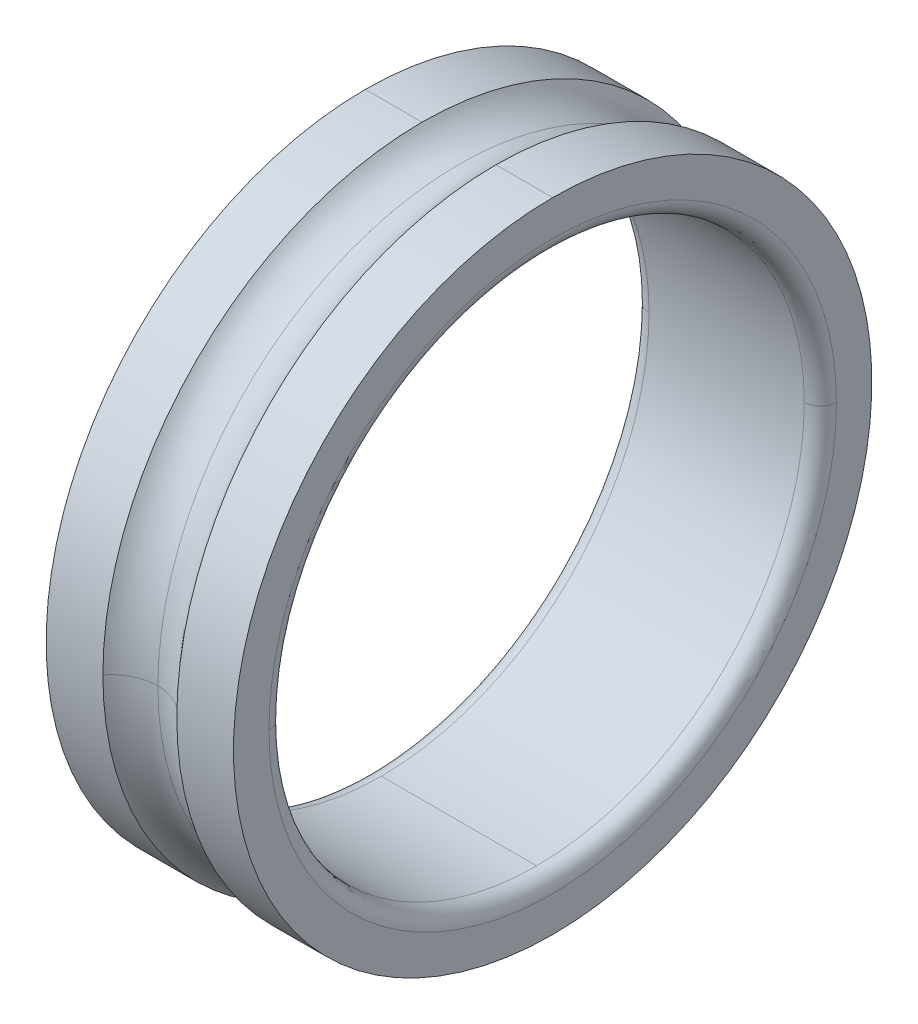
ISO-10303-21;
HEADER;
FILE_DESCRIPTION(('STEP AP214'),'2;1');
FILE_NAME('part.step','',(''),(''),'','','');
FILE_SCHEMA(('AUTOMOTIVE_DESIGN { 1 0 10303 214 1 1 1 1 }'));
ENDSEC;
DATA;
#1=APPLICATION_CONTEXT('core data for automotive mechanical design processes');
#2=APPLICATION_PROTOCOL_DEFINITION('international standard','automotive_design',2000,#1);
#3=PRODUCT_CONTEXT('',#1,'mechanical');
#4=PRODUCT('Part','Part','',(#3));
#5=PRODUCT_RELATED_PRODUCT_CATEGORY('part','',(#4));
#6=PRODUCT_DEFINITION_FORMATION('','',#4);
#7=PRODUCT_DEFINITION_CONTEXT('part definition',#1,'design');
#8=PRODUCT_DEFINITION('design','',#6,#7);
#9=PRODUCT_DEFINITION_SHAPE('','',#8);
#10=(LENGTH_UNIT() NAMED_UNIT(*) SI_UNIT(.MILLI.,.METRE.));
#11=(NAMED_UNIT(*) PLANE_ANGLE_UNIT() SI_UNIT($,.RADIAN.));
#12=(NAMED_UNIT(*) SI_UNIT($,.STERADIAN.) SOLID_ANGLE_UNIT());
#13=UNCERTAINTY_MEASURE_WITH_UNIT(LENGTH_MEASURE(1.E-05),#10,'distance_accuracy_value','');
#14=(GEOMETRIC_REPRESENTATION_CONTEXT(3) GLOBAL_UNCERTAINTY_ASSIGNED_CONTEXT((#13)) GLOBAL_UNIT_ASSIGNED_CONTEXT((#10,
#11,#12)) REPRESENTATION_CONTEXT('',''));
#15=CARTESIAN_POINT('',(0.,0.,0.));
#16=DIRECTION('',(0.,0.,1.));
#17=DIRECTION('',(1.,0.,0.));
#18=AXIS2_PLACEMENT_3D('',#15,#16,#17);
#19=CARTESIAN_POINT('',(7.,11.2625,0.));
#20=DIRECTION('',(1.,0.,0.));
#21=DIRECTION('',(0.,1.,0.));
#22=AXIS2_PLACEMENT_3D('',#19,#20,#21);
#23=PLANE('',#22);
#24=CARTESIAN_POINT('',(7.,0.,0.));
#25=DIRECTION('',(1.,0.,0.));
#26=DIRECTION('',(0.,1.,0.));
#27=AXIS2_PLACEMENT_3D('',#24,#25,#26);
#28=CIRCLE('',#27,10.6);
#29=CARTESIAN_POINT('',(7.,0.,-10.6));
#30=VERTEX_POINT('',#29);
#31=CARTESIAN_POINT('',(7.,0.,10.6));
#32=VERTEX_POINT('',#31);
#33=EDGE_CURVE('E130',#30,#32,#28,.T.);
#34=ORIENTED_EDGE('',*,*,#33,.F.);
#35=CARTESIAN_POINT('',(7.,0.,0.));
#36=DIRECTION('',(1.,0.,0.));
#37=DIRECTION('',(0.,1.,0.));
#38=AXIS2_PLACEMENT_3D('',#35,#36,#37);
#39=CIRCLE('',#38,10.6);
#40=EDGE_CURVE('E11',#32,#30,#39,.T.);
#41=ORIENTED_EDGE('',*,*,#40,.F.);
#42=EDGE_LOOP('',(#34,#41));
#43=FACE_BOUND('',#42,.T.);
#44=CARTESIAN_POINT('',(7.,0.,0.));
#45=DIRECTION('',(1.,0.,0.));
#46=DIRECTION('',(0.,1.,0.));
#47=AXIS2_PLACEMENT_3D('',#44,#45,#46);
#48=CIRCLE('',#47,11.925);
#49=CARTESIAN_POINT('',(7.,11.925,0.));
#50=VERTEX_POINT('',#49);
#51=CARTESIAN_POINT('',(7.,-11.925,0.));
#52=VERTEX_POINT('',#51);
#53=EDGE_CURVE('E43',#50,#52,#48,.T.);
#54=ORIENTED_EDGE('',*,*,#53,.T.);
#55=CARTESIAN_POINT('',(7.,0.,0.));
#56=DIRECTION('',(1.,0.,0.));
#57=DIRECTION('',(0.,1.,0.));
#58=AXIS2_PLACEMENT_3D('',#55,#56,#57);
#59=CIRCLE('',#58,11.925);
#60=EDGE_CURVE('E165',#52,#50,#59,.T.);
#61=ORIENTED_EDGE('',*,*,#60,.T.);
#62=EDGE_LOOP('',(#54,#61));
#63=FACE_BOUND('',#62,.T.);
#64=ADVANCED_FACE('F17',(#43,#63),#23,.T.);
#65=CARTESIAN_POINT('',(6.4,0.,0.));
#66=DIRECTION('',(1.,0.,0.));
#67=DIRECTION('',(0.,0.,-1.));
#68=AXIS2_PLACEMENT_3D('',#65,#66,#67);
#69=TOROIDAL_SURFACE('',#68,10.6,0.6);
#70=CARTESIAN_POINT('',(6.4,0.,10.6));
#71=DIRECTION('',(0.,1.,0.));
#72=DIRECTION('',(0.,0.,1.));
#73=AXIS2_PLACEMENT_3D('',#70,#71,#72);
#74=CIRCLE('',#73,0.6);
#75=CARTESIAN_POINT('',(6.4,0.,10.));
#76=VERTEX_POINT('',#75);
#77=EDGE_CURVE('E135',#32,#76,#74,.T.);
#78=ORIENTED_EDGE('',*,*,#77,.F.);
#79=ORIENTED_EDGE('',*,*,#40,.T.);
#80=CARTESIAN_POINT('',(6.4,0.,-10.6));
#81=DIRECTION('',(0.,-1.,0.));
#82=DIRECTION('',(0.,0.,-1.));
#83=AXIS2_PLACEMENT_3D('',#80,#81,#82);
#84=CIRCLE('',#83,0.6);
#85=CARTESIAN_POINT('',(6.4,0.,-10.));
#86=VERTEX_POINT('',#85);
#87=EDGE_CURVE('E147',#30,#86,#84,.T.);
#88=ORIENTED_EDGE('',*,*,#87,.T.);
#89=CARTESIAN_POINT('',(6.4,0.,0.));
#90=DIRECTION('',(1.,0.,0.));
#91=DIRECTION('',(0.,1.,0.));
#92=AXIS2_PLACEMENT_3D('',#89,#90,#91);
#93=CIRCLE('',#92,10.);
#94=CARTESIAN_POINT('',(6.4,-10.,0.));
#95=VERTEX_POINT('',#94);
#96=EDGE_CURVE('E28',#95,#86,#93,.T.);
#97=ORIENTED_EDGE('',*,*,#96,.F.);
#98=CARTESIAN_POINT('',(6.4,0.,0.));
#99=DIRECTION('',(1.,0.,0.));
#100=DIRECTION('',(0.,1.,0.));
#101=AXIS2_PLACEMENT_3D('',#98,#99,#100);
#102=CIRCLE('',#101,10.);
#103=EDGE_CURVE('E138',#76,#95,#102,.T.);
#104=ORIENTED_EDGE('',*,*,#103,.F.);
#105=EDGE_LOOP('',(#78,#79,#88,#97,#104));
#106=FACE_BOUND('',#105,.T.);
#107=ADVANCED_FACE('F136',(#106),#69,.T.);
#108=CARTESIAN_POINT('',(3.5,0.,0.));
#109=DIRECTION('',(-1.,0.,0.));
#110=DIRECTION('',(0.,1.,0.));
#111=AXIS2_PLACEMENT_3D('',#108,#109,#110);
#112=CYLINDRICAL_SURFACE('',#111,10.);
#113=DIRECTION('',(-1.,0.,0.));
#114=VECTOR('',#113,1.);
#115=CARTESIAN_POINT('',(3.5,-10.,0.));
#116=LINE('',#115,#114);
#117=CARTESIAN_POINT('',(0.6,-10.,0.));
#118=VERTEX_POINT('',#117);
#119=EDGE_CURVE('E176',#95,#118,#116,.T.);
#120=ORIENTED_EDGE('',*,*,#119,.F.);
#121=ORIENTED_EDGE('',*,*,#96,.T.);
#122=CARTESIAN_POINT('',(6.4,0.,0.));
#123=DIRECTION('',(1.,0.,0.));
#124=DIRECTION('',(0.,1.,0.));
#125=AXIS2_PLACEMENT_3D('',#122,#123,#124);
#126=CIRCLE('',#125,10.);
#127=CARTESIAN_POINT('',(6.4,10.,0.));
#128=VERTEX_POINT('',#127);
#129=EDGE_CURVE('E170',#86,#128,#126,.T.);
#130=ORIENTED_EDGE('',*,*,#129,.T.);
#131=DIRECTION('',(-1.,0.,0.));
#132=VECTOR('',#131,1.);
#133=CARTESIAN_POINT('',(3.5,10.,0.));
#134=LINE('',#133,#132);
#135=CARTESIAN_POINT('',(0.6,10.,0.));
#136=VERTEX_POINT('',#135);
#137=EDGE_CURVE('E208',#128,#136,#134,.T.);
#138=ORIENTED_EDGE('',*,*,#137,.T.);
#139=CARTESIAN_POINT('',(0.6,0.,0.));
#140=DIRECTION('',(1.,0.,0.));
#141=DIRECTION('',(0.,1.,0.));
#142=AXIS2_PLACEMENT_3D('',#139,#140,#141);
#143=CIRCLE('',#142,10.);
#144=CARTESIAN_POINT('',(0.6,0.,-10.));
#145=VERTEX_POINT('',#144);
#146=EDGE_CURVE('E270',#145,#136,#143,.T.);
#147=ORIENTED_EDGE('',*,*,#146,.F.);
#148=CARTESIAN_POINT('',(0.6,0.,0.));
#149=DIRECTION('',(1.,0.,0.));
#150=DIRECTION('',(0.,1.,0.));
#151=AXIS2_PLACEMENT_3D('',#148,#149,#150);
#152=CIRCLE('',#151,10.);
#153=EDGE_CURVE('E198',#118,#145,#152,.T.);
#154=ORIENTED_EDGE('',*,*,#153,.F.);
#155=EDGE_LOOP('',(#120,#121,#130,#138,#147,#154));
#156=FACE_BOUND('',#155,.T.);
#157=ADVANCED_FACE('F331',(#156),#112,.F.);
#158=CARTESIAN_POINT('',(0.6,0.,0.));
#159=DIRECTION('',(1.,0.,0.));
#160=DIRECTION('',(0.,0.,-1.));
#161=AXIS2_PLACEMENT_3D('',#158,#159,#160);
#162=TOROIDAL_SURFACE('',#161,10.6,0.6);
#163=CARTESIAN_POINT('',(0.6,0.,10.6));
#164=DIRECTION('',(0.,1.,0.));
#165=DIRECTION('',(0.,0.,1.));
#166=AXIS2_PLACEMENT_3D('',#163,#164,#165);
#167=CIRCLE('',#166,0.6);
#168=CARTESIAN_POINT('',(0.6,0.,10.));
#169=VERTEX_POINT('',#168);
#170=CARTESIAN_POINT('',(0.,0.,10.6));
#171=VERTEX_POINT('',#170);
#172=EDGE_CURVE('E189',#169,#171,#167,.T.);
#173=ORIENTED_EDGE('',*,*,#172,.F.);
#174=CARTESIAN_POINT('',(0.6,0.,0.));
#175=DIRECTION('',(1.,0.,0.));
#176=DIRECTION('',(0.,1.,0.));
#177=AXIS2_PLACEMENT_3D('',#174,#175,#176);
#178=CIRCLE('',#177,10.);
#179=EDGE_CURVE('E180',#169,#118,#178,.T.);
#180=ORIENTED_EDGE('',*,*,#179,.T.);
#181=ORIENTED_EDGE('',*,*,#153,.T.);
#182=CARTESIAN_POINT('',(0.6,0.,-10.6));
#183=DIRECTION('',(0.,-1.,0.));
#184=DIRECTION('',(0.,0.,-1.));
#185=AXIS2_PLACEMENT_3D('',#182,#183,#184);
#186=CIRCLE('',#185,0.6);
#187=CARTESIAN_POINT('',(0.,0.,-10.6));
#188=VERTEX_POINT('',#187);
#189=EDGE_CURVE('E188',#145,#188,#186,.T.);
#190=ORIENTED_EDGE('',*,*,#189,.T.);
#191=CARTESIAN_POINT('',(0.,0.,0.));
#192=DIRECTION('',(1.,0.,0.));
#193=DIRECTION('',(0.,1.,0.));
#194=AXIS2_PLACEMENT_3D('',#191,#192,#193);
#195=CIRCLE('',#194,10.6);
#196=EDGE_CURVE('E201',#171,#188,#195,.T.);
#197=ORIENTED_EDGE('',*,*,#196,.F.);
#198=EDGE_LOOP('',(#173,#180,#181,#190,#197));
#199=FACE_BOUND('',#198,.T.);
#200=ADVANCED_FACE('F19',(#199),#162,.T.);
#201=CARTESIAN_POINT('',(0.,11.2625,0.));
#202=DIRECTION('',(-1.,0.,0.));
#203=DIRECTION('',(0.,0.,1.));
#204=AXIS2_PLACEMENT_3D('',#201,#202,#203);
#205=PLANE('',#204);
#206=CARTESIAN_POINT('',(0.,0.,0.));
#207=DIRECTION('',(1.,0.,0.));
#208=DIRECTION('',(0.,1.,0.));
#209=AXIS2_PLACEMENT_3D('',#206,#207,#208);
#210=CIRCLE('',#209,10.6);
#211=EDGE_CURVE('E184',#188,#171,#210,.T.);
#212=ORIENTED_EDGE('',*,*,#211,.T.);
#213=ORIENTED_EDGE('',*,*,#196,.T.);
#214=EDGE_LOOP('',(#212,#213));
#215=FACE_BOUND('',#214,.T.);
#216=CARTESIAN_POINT('',(0.,0.,0.));
#217=DIRECTION('',(1.,0.,0.));
#218=DIRECTION('',(0.,1.,0.));
#219=AXIS2_PLACEMENT_3D('',#216,#217,#218);
#220=CIRCLE('',#219,11.925);
#221=CARTESIAN_POINT('',(0.,11.925,0.));
#222=VERTEX_POINT('',#221);
#223=CARTESIAN_POINT('',(0.,-11.925,0.));
#224=VERTEX_POINT('',#223);
#225=EDGE_CURVE('E221',#222,#224,#220,.T.);
#226=ORIENTED_EDGE('',*,*,#225,.F.);
#227=CARTESIAN_POINT('',(0.,0.,0.));
#228=DIRECTION('',(1.,0.,0.));
#229=DIRECTION('',(0.,1.,0.));
#230=AXIS2_PLACEMENT_3D('',#227,#228,#229);
#231=CIRCLE('',#230,11.925);
#232=EDGE_CURVE('E190',#224,#222,#231,.T.);
#233=ORIENTED_EDGE('',*,*,#232,.F.);
#234=EDGE_LOOP('',(#226,#233));
#235=FACE_BOUND('',#234,.T.);
#236=ADVANCED_FACE('F333',(#215,#235),#205,.T.);
#237=CARTESIAN_POINT('',(1.05955177601793,0.,0.));
#238=DIRECTION('',(-1.,0.,0.));
#239=DIRECTION('',(0.,1.,0.));
#240=AXIS2_PLACEMENT_3D('',#237,#238,#239);
#241=CYLINDRICAL_SURFACE('',#240,11.925);
#242=DIRECTION('',(-1.,0.,0.));
#243=VECTOR('',#242,1.);
#244=CARTESIAN_POINT('',(1.05955177601793,-11.925,0.));
#245=LINE('',#244,#243);
#246=CARTESIAN_POINT('',(2.11910355203586,-11.925,0.));
#247=VERTEX_POINT('',#246);
#248=EDGE_CURVE('E194',#247,#224,#245,.T.);
#249=ORIENTED_EDGE('',*,*,#248,.F.);
#250=CARTESIAN_POINT('',(2.11910355203586,0.,0.));
#251=DIRECTION('',(1.,0.,0.));
#252=DIRECTION('',(0.,1.,0.));
#253=AXIS2_PLACEMENT_3D('',#250,#251,#252);
#254=CIRCLE('',#253,11.925);
#255=CARTESIAN_POINT('',(2.11910355203586,0.,11.925));
#256=VERTEX_POINT('',#255);
#257=EDGE_CURVE('E181',#256,#247,#254,.T.);
#258=ORIENTED_EDGE('',*,*,#257,.F.);
#259=CARTESIAN_POINT('',(2.11910355203586,0.,0.));
#260=DIRECTION('',(1.,0.,0.));
#261=DIRECTION('',(0.,1.,0.));
#262=AXIS2_PLACEMENT_3D('',#259,#260,#261);
#263=CIRCLE('',#262,11.925);
#264=CARTESIAN_POINT('',(2.11910355203586,11.925,0.));
#265=VERTEX_POINT('',#264);
#266=EDGE_CURVE('E218',#265,#256,#263,.T.);
#267=ORIENTED_EDGE('',*,*,#266,.F.);
#268=DIRECTION('',(-1.,0.,0.));
#269=VECTOR('',#268,1.);
#270=CARTESIAN_POINT('',(1.05955177601793,11.925,0.));
#271=LINE('',#270,#269);
#272=EDGE_CURVE('E164',#265,#222,#271,.T.);
#273=ORIENTED_EDGE('',*,*,#272,.T.);
#274=ORIENTED_EDGE('',*,*,#225,.T.);
#275=EDGE_LOOP('',(#249,#258,#267,#273,#274));
#276=FACE_BOUND('',#275,.T.);
#277=ADVANCED_FACE('F463',(#276),#241,.T.);
#278=CARTESIAN_POINT('',(3.5,0.,0.));
#279=DIRECTION('',(1.,0.,0.));
#280=DIRECTION('',(0.,0.,-1.));
#281=AXIS2_PLACEMENT_3D('',#278,#279,#280);
#282=TOROIDAL_SURFACE('',#281,13.,1.75);
#283=CARTESIAN_POINT('',(3.5,0.,0.));
#284=DIRECTION('',(1.,0.,0.));
#285=DIRECTION('',(0.,0.,-1.));
#286=AXIS2_PLACEMENT_3D('',#283,#284,#285);
#287=CIRCLE('',#286,11.25);
#288=CARTESIAN_POINT('',(3.5,0.,-11.25));
#289=VERTEX_POINT('',#288);
#290=CARTESIAN_POINT('',(3.5,0.,11.25));
#291=VERTEX_POINT('',#290);
#292=EDGE_CURVE('E229',#289,#291,#287,.T.);
#293=ORIENTED_EDGE('',*,*,#292,.F.);
#294=CARTESIAN_POINT('',(3.5,0.,-13.));
#295=DIRECTION('',(0.,-1.,0.));
#296=DIRECTION('',(0.,0.,-1.));
#297=AXIS2_PLACEMENT_3D('',#294,#295,#296);
#298=CIRCLE('',#297,1.75);
#299=CARTESIAN_POINT('',(2.11910355203586,0.,-11.925));
#300=VERTEX_POINT('',#299);
#301=EDGE_CURVE('E21',#289,#300,#298,.T.);
#302=ORIENTED_EDGE('',*,*,#301,.T.);
#303=CARTESIAN_POINT('',(2.11910355203586,0.,0.));
#304=DIRECTION('',(1.,0.,0.));
#305=DIRECTION('',(0.,1.,0.));
#306=AXIS2_PLACEMENT_3D('',#303,#304,#305);
#307=CIRCLE('',#306,11.925);
#308=EDGE_CURVE('E160',#300,#265,#307,.T.);
#309=ORIENTED_EDGE('',*,*,#308,.T.);
#310=ORIENTED_EDGE('',*,*,#266,.T.);
#311=CARTESIAN_POINT('',(3.5,0.,13.));
#312=DIRECTION('',(0.,1.,0.));
#313=DIRECTION('',(0.,0.,1.));
#314=AXIS2_PLACEMENT_3D('',#311,#312,#313);
#315=CIRCLE('',#314,1.75);
#316=EDGE_CURVE('E163',#291,#256,#315,.T.);
#317=ORIENTED_EDGE('',*,*,#316,.F.);
#318=EDGE_LOOP('',(#293,#302,#309,#310,#317));
#319=FACE_BOUND('',#318,.T.);
#320=ADVANCED_FACE('F304',(#319),#282,.F.);
#321=CARTESIAN_POINT('',(5.94044822398207,0.,0.));
#322=DIRECTION('',(-1.,0.,0.));
#323=DIRECTION('',(0.,1.,0.));
#324=AXIS2_PLACEMENT_3D('',#321,#322,#323);
#325=CYLINDRICAL_SURFACE('',#324,11.925);
#326=DIRECTION('',(-1.,0.,0.));
#327=VECTOR('',#326,1.);
#328=CARTESIAN_POINT('',(5.94044822398207,-11.925,0.));
#329=LINE('',#328,#327);
#330=CARTESIAN_POINT('',(4.88089644796414,-11.925,0.));
#331=VERTEX_POINT('',#330);
#332=EDGE_CURVE('E169',#52,#331,#329,.T.);
#333=ORIENTED_EDGE('',*,*,#332,.F.);
#334=ORIENTED_EDGE('',*,*,#53,.F.);
#335=DIRECTION('',(-1.,0.,0.));
#336=VECTOR('',#335,1.);
#337=CARTESIAN_POINT('',(5.94044822398207,11.925,0.));
#338=LINE('',#337,#336);
#339=CARTESIAN_POINT('',(4.88089644796414,11.925,0.));
#340=VERTEX_POINT('',#339);
#341=EDGE_CURVE('E209',#50,#340,#338,.T.);
#342=ORIENTED_EDGE('',*,*,#341,.T.);
#343=CARTESIAN_POINT('',(4.88089644796414,0.,0.));
#344=DIRECTION('',(1.,0.,0.));
#345=DIRECTION('',(0.,1.,0.));
#346=AXIS2_PLACEMENT_3D('',#343,#344,#345);
#347=CIRCLE('',#346,11.925);
#348=CARTESIAN_POINT('',(4.88089644796414,0.,11.925));
#349=VERTEX_POINT('',#348);
#350=EDGE_CURVE('E217',#340,#349,#347,.T.);
#351=ORIENTED_EDGE('',*,*,#350,.T.);
#352=CARTESIAN_POINT('',(4.88089644796414,0.,0.));
#353=DIRECTION('',(1.,0.,0.));
#354=DIRECTION('',(0.,1.,0.));
#355=AXIS2_PLACEMENT_3D('',#352,#353,#354);
#356=CIRCLE('',#355,11.925);
#357=EDGE_CURVE('E149',#349,#331,#356,.T.);
#358=ORIENTED_EDGE('',*,*,#357,.T.);
#359=EDGE_LOOP('',(#333,#334,#342,#351,#358));
#360=FACE_BOUND('',#359,.T.);
#361=ADVANCED_FACE('F246',(#360),#325,.T.);
#362=CARTESIAN_POINT('',(5.94044822398207,0.,0.));
#363=DIRECTION('',(-1.,0.,0.));
#364=DIRECTION('',(0.,1.,0.));
#365=AXIS2_PLACEMENT_3D('',#362,#363,#364);
#366=CYLINDRICAL_SURFACE('',#365,11.925);
#367=ORIENTED_EDGE('',*,*,#60,.F.);
#368=ORIENTED_EDGE('',*,*,#332,.T.);
#369=CARTESIAN_POINT('',(4.88089644796414,0.,0.));
#370=DIRECTION('',(1.,0.,0.));
#371=DIRECTION('',(0.,1.,0.));
#372=AXIS2_PLACEMENT_3D('',#369,#370,#371);
#373=CIRCLE('',#372,11.925);
#374=CARTESIAN_POINT('',(4.88089644796414,0.,-11.925));
#375=VERTEX_POINT('',#374);
#376=EDGE_CURVE('E156',#331,#375,#373,.T.);
#377=ORIENTED_EDGE('',*,*,#376,.T.);
#378=CARTESIAN_POINT('',(4.88089644796414,0.,0.));
#379=DIRECTION('',(1.,0.,0.));
#380=DIRECTION('',(0.,1.,0.));
#381=AXIS2_PLACEMENT_3D('',#378,#379,#380);
#382=CIRCLE('',#381,11.925);
#383=EDGE_CURVE('E212',#375,#340,#382,.T.);
#384=ORIENTED_EDGE('',*,*,#383,.T.);
#385=ORIENTED_EDGE('',*,*,#341,.F.);
#386=EDGE_LOOP('',(#367,#368,#377,#384,#385));
#387=FACE_BOUND('',#386,.T.);
#388=ADVANCED_FACE('F251',(#387),#366,.T.);
#389=CARTESIAN_POINT('',(3.5,0.,0.));
#390=DIRECTION('',(1.,0.,0.));
#391=DIRECTION('',(0.,0.,-1.));
#392=AXIS2_PLACEMENT_3D('',#389,#390,#391);
#393=TOROIDAL_SURFACE('',#392,13.,1.75);
#394=CARTESIAN_POINT('',(3.5,0.,0.));
#395=DIRECTION('',(1.,0.,0.));
#396=DIRECTION('',(0.,0.,-1.));
#397=AXIS2_PLACEMENT_3D('',#394,#395,#396);
#398=CIRCLE('',#397,11.25);
#399=EDGE_CURVE('E216',#291,#289,#398,.T.);
#400=ORIENTED_EDGE('',*,*,#399,.F.);
#401=ORIENTED_EDGE('',*,*,#316,.T.);
#402=ORIENTED_EDGE('',*,*,#257,.T.);
#403=CARTESIAN_POINT('',(2.11910355203586,0.,0.));
#404=DIRECTION('',(1.,0.,0.));
#405=DIRECTION('',(0.,1.,0.));
#406=AXIS2_PLACEMENT_3D('',#403,#404,#405);
#407=CIRCLE('',#406,11.925);
#408=EDGE_CURVE('E238',#247,#300,#407,.T.);
#409=ORIENTED_EDGE('',*,*,#408,.T.);
#410=ORIENTED_EDGE('',*,*,#301,.F.);
#411=EDGE_LOOP('',(#400,#401,#402,#409,#410));
#412=FACE_BOUND('',#411,.T.);
#413=ADVANCED_FACE('F513',(#412),#393,.F.);
#414=CARTESIAN_POINT('',(1.05955177601793,0.,0.));
#415=DIRECTION('',(-1.,0.,0.));
#416=DIRECTION('',(0.,1.,0.));
#417=AXIS2_PLACEMENT_3D('',#414,#415,#416);
#418=CYLINDRICAL_SURFACE('',#417,11.925);
#419=ORIENTED_EDGE('',*,*,#408,.F.);
#420=ORIENTED_EDGE('',*,*,#248,.T.);
#421=ORIENTED_EDGE('',*,*,#232,.T.);
#422=ORIENTED_EDGE('',*,*,#272,.F.);
#423=ORIENTED_EDGE('',*,*,#308,.F.);
#424=EDGE_LOOP('',(#419,#420,#421,#422,#423));
#425=FACE_BOUND('',#424,.T.);
#426=ADVANCED_FACE('F521',(#425),#418,.T.);
#427=CARTESIAN_POINT('',(0.6,0.,0.));
#428=DIRECTION('',(1.,0.,0.));
#429=DIRECTION('',(0.,0.,-1.));
#430=AXIS2_PLACEMENT_3D('',#427,#428,#429);
#431=TOROIDAL_SURFACE('',#430,10.6,0.6);
#432=ORIENTED_EDGE('',*,*,#146,.T.);
#433=CARTESIAN_POINT('',(0.6,0.,0.));
#434=DIRECTION('',(1.,0.,0.));
#435=DIRECTION('',(0.,1.,0.));
#436=AXIS2_PLACEMENT_3D('',#433,#434,#435);
#437=CIRCLE('',#436,10.);
#438=EDGE_CURVE('E204',#136,#169,#437,.T.);
#439=ORIENTED_EDGE('',*,*,#438,.T.);
#440=ORIENTED_EDGE('',*,*,#172,.T.);
#441=ORIENTED_EDGE('',*,*,#211,.F.);
#442=ORIENTED_EDGE('',*,*,#189,.F.);
#443=EDGE_LOOP('',(#432,#439,#440,#441,#442));
#444=FACE_BOUND('',#443,.T.);
#445=ADVANCED_FACE('F324',(#444),#431,.T.);
#446=CARTESIAN_POINT('',(3.5,0.,0.));
#447=DIRECTION('',(-1.,0.,0.));
#448=DIRECTION('',(0.,1.,0.));
#449=AXIS2_PLACEMENT_3D('',#446,#447,#448);
#450=CYLINDRICAL_SURFACE('',#449,10.);
#451=CARTESIAN_POINT('',(6.4,0.,0.));
#452=DIRECTION('',(1.,0.,0.));
#453=DIRECTION('',(0.,1.,0.));
#454=AXIS2_PLACEMENT_3D('',#451,#452,#453);
#455=CIRCLE('',#454,10.);
#456=EDGE_CURVE('E143',#128,#76,#455,.T.);
#457=ORIENTED_EDGE('',*,*,#456,.T.);
#458=ORIENTED_EDGE('',*,*,#103,.T.);
#459=ORIENTED_EDGE('',*,*,#119,.T.);
#460=ORIENTED_EDGE('',*,*,#179,.F.);
#461=ORIENTED_EDGE('',*,*,#438,.F.);
#462=ORIENTED_EDGE('',*,*,#137,.F.);
#463=EDGE_LOOP('',(#457,#458,#459,#460,#461,#462));
#464=FACE_BOUND('',#463,.T.);
#465=ADVANCED_FACE('F328',(#464),#450,.F.);
#466=CARTESIAN_POINT('',(6.4,0.,0.));
#467=DIRECTION('',(1.,0.,0.));
#468=DIRECTION('',(0.,0.,-1.));
#469=AXIS2_PLACEMENT_3D('',#466,#467,#468);
#470=TOROIDAL_SURFACE('',#469,10.6,0.6);
#471=ORIENTED_EDGE('',*,*,#33,.T.);
#472=ORIENTED_EDGE('',*,*,#77,.T.);
#473=ORIENTED_EDGE('',*,*,#456,.F.);
#474=ORIENTED_EDGE('',*,*,#129,.F.);
#475=ORIENTED_EDGE('',*,*,#87,.F.);
#476=EDGE_LOOP('',(#471,#472,#473,#474,#475));
#477=FACE_BOUND('',#476,.T.);
#478=ADVANCED_FACE('F145',(#477),#470,.T.);
#479=CARTESIAN_POINT('',(3.5,0.,0.));
#480=DIRECTION('',(1.,0.,0.));
#481=DIRECTION('',(0.,0.,-1.));
#482=AXIS2_PLACEMENT_3D('',#479,#480,#481);
#483=TOROIDAL_SURFACE('',#482,13.,1.75);
#484=CARTESIAN_POINT('',(3.5,0.,13.));
#485=DIRECTION('',(0.,1.,0.));
#486=DIRECTION('',(0.,0.,1.));
#487=AXIS2_PLACEMENT_3D('',#484,#485,#486);
#488=CIRCLE('',#487,1.75);
#489=EDGE_CURVE('E233',#349,#291,#488,.T.);
#490=ORIENTED_EDGE('',*,*,#489,.T.);
#491=ORIENTED_EDGE('',*,*,#399,.T.);
#492=CARTESIAN_POINT('',(3.5,0.,-13.));
#493=DIRECTION('',(0.,-1.,0.));
#494=DIRECTION('',(0.,0.,-1.));
#495=AXIS2_PLACEMENT_3D('',#492,#493,#494);
#496=CIRCLE('',#495,1.75);
#497=EDGE_CURVE('E234',#375,#289,#496,.T.);
#498=ORIENTED_EDGE('',*,*,#497,.F.);
#499=ORIENTED_EDGE('',*,*,#376,.F.);
#500=ORIENTED_EDGE('',*,*,#357,.F.);
#501=EDGE_LOOP('',(#490,#491,#498,#499,#500));
#502=FACE_BOUND('',#501,.T.);
#503=ADVANCED_FACE('F299',(#502),#483,.F.);
#504=CARTESIAN_POINT('',(3.5,0.,0.));
#505=DIRECTION('',(1.,0.,0.));
#506=DIRECTION('',(0.,0.,-1.));
#507=AXIS2_PLACEMENT_3D('',#504,#505,#506);
#508=TOROIDAL_SURFACE('',#507,13.,1.75);
#509=ORIENTED_EDGE('',*,*,#497,.T.);
#510=ORIENTED_EDGE('',*,*,#292,.T.);
#511=ORIENTED_EDGE('',*,*,#489,.F.);
#512=ORIENTED_EDGE('',*,*,#350,.F.);
#513=ORIENTED_EDGE('',*,*,#383,.F.);
#514=EDGE_LOOP('',(#509,#510,#511,#512,#513));
#515=FACE_BOUND('',#514,.T.);
#516=ADVANCED_FACE('F259',(#515),#508,.F.);
#517=CLOSED_SHELL('',(#64,#107,#157,#200,#236,#277,#320,#361,#388,#413,#426,#445,#465,#478,#503,#516));
#518=MANIFOLD_SOLID_BREP('B1',#517);
#519=ADVANCED_BREP_SHAPE_REPRESENTATION('',(#18,#518),#14);
#520=SHAPE_DEFINITION_REPRESENTATION(#9,#519);
ENDSEC;
END-ISO-10303-21;
